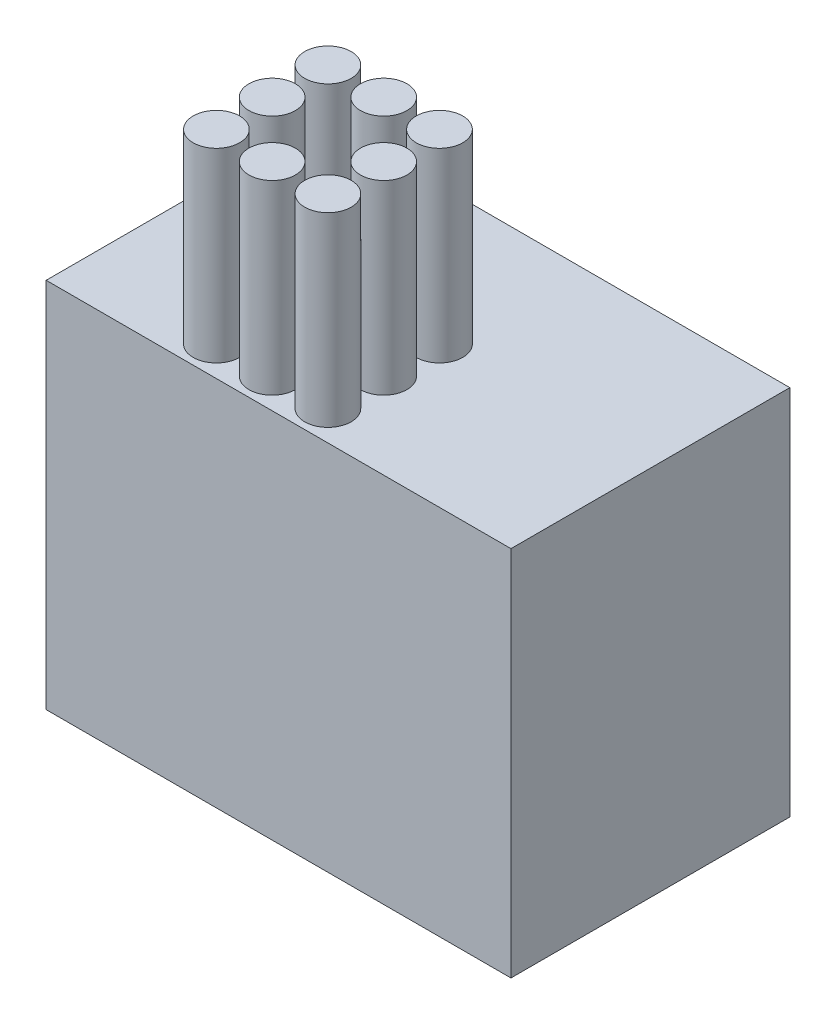
ISO-10303-21;
HEADER;
FILE_DESCRIPTION(('STEP AP214'),'2;1');
FILE_NAME('part.step','',(''),(''),'','','');
FILE_SCHEMA(('AUTOMOTIVE_DESIGN { 1 0 10303 214 1 1 1 1 }'));
ENDSEC;
DATA;
#1=APPLICATION_CONTEXT('core data for automotive mechanical design processes');
#2=APPLICATION_PROTOCOL_DEFINITION('international standard','automotive_design',2000,#1);
#3=PRODUCT_CONTEXT('',#1,'mechanical');
#4=PRODUCT('Part','Part','',(#3));
#5=PRODUCT_RELATED_PRODUCT_CATEGORY('part','',(#4));
#6=PRODUCT_DEFINITION_FORMATION('','',#4);
#7=PRODUCT_DEFINITION_CONTEXT('part definition',#1,'design');
#8=PRODUCT_DEFINITION('design','',#6,#7);
#9=PRODUCT_DEFINITION_SHAPE('','',#8);
#10=(LENGTH_UNIT() NAMED_UNIT(*) SI_UNIT(.MILLI.,.METRE.));
#11=(NAMED_UNIT(*) PLANE_ANGLE_UNIT() SI_UNIT($,.RADIAN.));
#12=(NAMED_UNIT(*) SI_UNIT($,.STERADIAN.) SOLID_ANGLE_UNIT());
#13=UNCERTAINTY_MEASURE_WITH_UNIT(LENGTH_MEASURE(1.E-05),#10,'distance_accuracy_value','');
#14=(GEOMETRIC_REPRESENTATION_CONTEXT(3) GLOBAL_UNCERTAINTY_ASSIGNED_CONTEXT((#13)) GLOBAL_UNIT_ASSIGNED_CONTEXT((#10,
#11,#12)) REPRESENTATION_CONTEXT('',''));
#15=CARTESIAN_POINT('',(0.,0.,0.));
#16=DIRECTION('',(0.,0.,1.));
#17=DIRECTION('',(1.,0.,0.));
#18=AXIS2_PLACEMENT_3D('',#15,#16,#17);
#19=CARTESIAN_POINT('',(38.3392416738444,50.8,68.0273515144054));
#20=DIRECTION('',(0.,1.,0.));
#21=DIRECTION('',(0.,0.,1.));
#22=AXIS2_PLACEMENT_3D('',#19,#20,#21);
#23=PLANE('',#22);
#24=CARTESIAN_POINT('',(38.3392416738444,50.8,68.0273515144054));
#25=DIRECTION('',(0.,1.,0.));
#26=DIRECTION('',(0.,0.,1.));
#27=AXIS2_PLACEMENT_3D('',#24,#25,#26);
#28=CIRCLE('',#27,6.35);
#29=CARTESIAN_POINT('',(38.3392416738444,50.8,74.3773515144054));
#30=VERTEX_POINT('',#29);
#31=EDGE_CURVE('E11',#30,#30,#28,.T.);
#32=ORIENTED_EDGE('',*,*,#31,.T.);
#33=EDGE_LOOP('',(#32));
#34=FACE_BOUND('',#33,.T.);
#35=ADVANCED_FACE('F44',(#34),#23,.T.);
#36=CARTESIAN_POINT('',(38.3392416738444,50.8,68.0273515144054));
#37=DIRECTION('',(0.,-1.,0.));
#38=DIRECTION('',(0.,0.,-1.));
#39=AXIS2_PLACEMENT_3D('',#36,#37,#38);
#40=CYLINDRICAL_SURFACE('',#39,6.35);
#41=ORIENTED_EDGE('',*,*,#31,.F.);
#42=EDGE_LOOP('',(#41));
#43=FACE_BOUND('',#42,.T.);
#44=CARTESIAN_POINT('',(38.3392416738444,0.,68.0273515144054));
#45=DIRECTION('',(0.,-1.,0.));
#46=DIRECTION('',(0.,0.,-1.));
#47=AXIS2_PLACEMENT_3D('',#44,#45,#46);
#48=CIRCLE('',#47,6.35);
#49=CARTESIAN_POINT('',(38.3392416738444,0.,61.6773515144054));
#50=VERTEX_POINT('',#49);
#51=EDGE_CURVE('E53',#50,#50,#48,.F.);
#52=ORIENTED_EDGE('',*,*,#51,.T.);
#53=EDGE_LOOP('',(#52));
#54=FACE_BOUND('',#53,.T.);
#55=ADVANCED_FACE('F184',(#43,#54),#40,.T.);
#56=CARTESIAN_POINT('',(53.5792416738444,50.8,68.0273515144054));
#57=DIRECTION('',(0.,1.,0.));
#58=DIRECTION('',(0.,0.,1.));
#59=AXIS2_PLACEMENT_3D('',#56,#57,#58);
#60=PLANE('',#59);
#61=CARTESIAN_POINT('',(53.5792416738444,50.8,68.0273515144054));
#62=DIRECTION('',(0.,1.,0.));
#63=DIRECTION('',(0.,0.,1.));
#64=AXIS2_PLACEMENT_3D('',#61,#62,#63);
#65=CIRCLE('',#64,6.35);
#66=CARTESIAN_POINT('',(53.5792416738444,50.8,74.3773515144054));
#67=VERTEX_POINT('',#66);
#68=EDGE_CURVE('E177',#67,#67,#65,.T.);
#69=ORIENTED_EDGE('',*,*,#68,.T.);
#70=EDGE_LOOP('',(#69));
#71=FACE_BOUND('',#70,.T.);
#72=ADVANCED_FACE('F205',(#71),#60,.T.);
#73=CARTESIAN_POINT('',(53.5792416738444,50.8,68.0273515144054));
#74=DIRECTION('',(0.,-1.,0.));
#75=DIRECTION('',(0.,0.,-1.));
#76=AXIS2_PLACEMENT_3D('',#73,#74,#75);
#77=CYLINDRICAL_SURFACE('',#76,6.35);
#78=ORIENTED_EDGE('',*,*,#68,.F.);
#79=EDGE_LOOP('',(#78));
#80=FACE_BOUND('',#79,.T.);
#81=CARTESIAN_POINT('',(53.5792416738444,0.,68.0273515144054));
#82=DIRECTION('',(0.,-1.,0.));
#83=DIRECTION('',(0.,0.,-1.));
#84=AXIS2_PLACEMENT_3D('',#81,#82,#83);
#85=CIRCLE('',#84,6.35);
#86=CARTESIAN_POINT('',(53.5792416738444,0.,61.6773515144054));
#87=VERTEX_POINT('',#86);
#88=EDGE_CURVE('E173',#87,#87,#85,.F.);
#89=ORIENTED_EDGE('',*,*,#88,.T.);
#90=EDGE_LOOP('',(#89));
#91=FACE_BOUND('',#90,.T.);
#92=ADVANCED_FACE('F211',(#80,#91),#77,.T.);
#93=CARTESIAN_POINT('',(68.8192416738444,50.8,68.0273515144054));
#94=DIRECTION('',(0.,1.,0.));
#95=DIRECTION('',(0.,0.,1.));
#96=AXIS2_PLACEMENT_3D('',#93,#94,#95);
#97=PLANE('',#96);
#98=CARTESIAN_POINT('',(68.8192416738444,50.8,68.0273515144054));
#99=DIRECTION('',(0.,1.,0.));
#100=DIRECTION('',(0.,0.,1.));
#101=AXIS2_PLACEMENT_3D('',#98,#99,#100);
#102=CIRCLE('',#101,6.35);
#103=CARTESIAN_POINT('',(68.8192416738444,50.8,74.3773515144054));
#104=VERTEX_POINT('',#103);
#105=EDGE_CURVE('E169',#104,#104,#102,.T.);
#106=ORIENTED_EDGE('',*,*,#105,.T.);
#107=EDGE_LOOP('',(#106));
#108=FACE_BOUND('',#107,.T.);
#109=ADVANCED_FACE('F217',(#108),#97,.T.);
#110=CARTESIAN_POINT('',(68.8192416738444,50.8,68.0273515144054));
#111=DIRECTION('',(0.,-1.,0.));
#112=DIRECTION('',(0.,0.,-1.));
#113=AXIS2_PLACEMENT_3D('',#110,#111,#112);
#114=CYLINDRICAL_SURFACE('',#113,6.35);
#115=ORIENTED_EDGE('',*,*,#105,.F.);
#116=EDGE_LOOP('',(#115));
#117=FACE_BOUND('',#116,.T.);
#118=CARTESIAN_POINT('',(68.8192416738444,0.,68.0273515144054));
#119=DIRECTION('',(0.,-1.,0.));
#120=DIRECTION('',(0.,0.,-1.));
#121=AXIS2_PLACEMENT_3D('',#118,#119,#120);
#122=CIRCLE('',#121,6.35);
#123=CARTESIAN_POINT('',(68.8192416738444,0.,61.6773515144054));
#124=VERTEX_POINT('',#123);
#125=EDGE_CURVE('E165',#124,#124,#122,.F.);
#126=ORIENTED_EDGE('',*,*,#125,.T.);
#127=EDGE_LOOP('',(#126));
#128=FACE_BOUND('',#127,.T.);
#129=ADVANCED_FACE('F221',(#117,#128),#114,.T.);
#130=CARTESIAN_POINT('',(38.3392416738444,50.8,52.7873515144054));
#131=DIRECTION('',(0.,1.,0.));
#132=DIRECTION('',(0.,0.,1.));
#133=AXIS2_PLACEMENT_3D('',#130,#131,#132);
#134=PLANE('',#133);
#135=CARTESIAN_POINT('',(38.3392416738444,50.8,52.7873515144054));
#136=DIRECTION('',(0.,1.,0.));
#137=DIRECTION('',(0.,0.,1.));
#138=AXIS2_PLACEMENT_3D('',#135,#136,#137);
#139=CIRCLE('',#138,6.35);
#140=CARTESIAN_POINT('',(38.3392416738444,50.8,59.1373515144054));
#141=VERTEX_POINT('',#140);
#142=EDGE_CURVE('E161',#141,#141,#139,.T.);
#143=ORIENTED_EDGE('',*,*,#142,.T.);
#144=EDGE_LOOP('',(#143));
#145=FACE_BOUND('',#144,.T.);
#146=ADVANCED_FACE('F225',(#145),#134,.T.);
#147=CARTESIAN_POINT('',(38.3392416738444,50.8,52.7873515144054));
#148=DIRECTION('',(0.,-1.,0.));
#149=DIRECTION('',(0.,0.,-1.));
#150=AXIS2_PLACEMENT_3D('',#147,#148,#149);
#151=CYLINDRICAL_SURFACE('',#150,6.35);
#152=ORIENTED_EDGE('',*,*,#142,.F.);
#153=EDGE_LOOP('',(#152));
#154=FACE_BOUND('',#153,.T.);
#155=CARTESIAN_POINT('',(38.3392416738444,0.,52.7873515144054));
#156=DIRECTION('',(0.,-1.,0.));
#157=DIRECTION('',(0.,0.,-1.));
#158=AXIS2_PLACEMENT_3D('',#155,#156,#157);
#159=CIRCLE('',#158,6.35);
#160=CARTESIAN_POINT('',(38.3392416738444,0.,46.4373515144054));
#161=VERTEX_POINT('',#160);
#162=EDGE_CURVE('E157',#161,#161,#159,.F.);
#163=ORIENTED_EDGE('',*,*,#162,.T.);
#164=EDGE_LOOP('',(#163));
#165=FACE_BOUND('',#164,.T.);
#166=ADVANCED_FACE('F229',(#154,#165),#151,.T.);
#167=CARTESIAN_POINT('',(68.8192416738444,50.8,52.7873515144054));
#168=DIRECTION('',(0.,1.,0.));
#169=DIRECTION('',(0.,0.,1.));
#170=AXIS2_PLACEMENT_3D('',#167,#168,#169);
#171=PLANE('',#170);
#172=CARTESIAN_POINT('',(68.8192416738444,50.8,52.7873515144054));
#173=DIRECTION('',(0.,1.,0.));
#174=DIRECTION('',(0.,0.,1.));
#175=AXIS2_PLACEMENT_3D('',#172,#173,#174);
#176=CIRCLE('',#175,6.35);
#177=CARTESIAN_POINT('',(68.8192416738444,50.8,59.1373515144054));
#178=VERTEX_POINT('',#177);
#179=EDGE_CURVE('E153',#178,#178,#176,.T.);
#180=ORIENTED_EDGE('',*,*,#179,.T.);
#181=EDGE_LOOP('',(#180));
#182=FACE_BOUND('',#181,.T.);
#183=ADVANCED_FACE('F233',(#182),#171,.T.);
#184=CARTESIAN_POINT('',(68.8192416738444,50.8,52.7873515144054));
#185=DIRECTION('',(0.,-1.,0.));
#186=DIRECTION('',(0.,0.,-1.));
#187=AXIS2_PLACEMENT_3D('',#184,#185,#186);
#188=CYLINDRICAL_SURFACE('',#187,6.35);
#189=ORIENTED_EDGE('',*,*,#179,.F.);
#190=EDGE_LOOP('',(#189));
#191=FACE_BOUND('',#190,.T.);
#192=CARTESIAN_POINT('',(68.8192416738444,0.,52.7873515144054));
#193=DIRECTION('',(0.,-1.,0.));
#194=DIRECTION('',(0.,0.,-1.));
#195=AXIS2_PLACEMENT_3D('',#192,#193,#194);
#196=CIRCLE('',#195,6.35);
#197=CARTESIAN_POINT('',(68.8192416738444,0.,46.4373515144054));
#198=VERTEX_POINT('',#197);
#199=EDGE_CURVE('E149',#198,#198,#196,.F.);
#200=ORIENTED_EDGE('',*,*,#199,.T.);
#201=EDGE_LOOP('',(#200));
#202=FACE_BOUND('',#201,.T.);
#203=ADVANCED_FACE('F237',(#191,#202),#188,.T.);
#204=CARTESIAN_POINT('',(38.3392416738444,50.8,37.5473515144054));
#205=DIRECTION('',(0.,1.,0.));
#206=DIRECTION('',(0.,0.,1.));
#207=AXIS2_PLACEMENT_3D('',#204,#205,#206);
#208=PLANE('',#207);
#209=CARTESIAN_POINT('',(38.3392416738444,50.8,37.5473515144054));
#210=DIRECTION('',(0.,1.,0.));
#211=DIRECTION('',(0.,0.,1.));
#212=AXIS2_PLACEMENT_3D('',#209,#210,#211);
#213=CIRCLE('',#212,6.35);
#214=CARTESIAN_POINT('',(38.3392416738444,50.8,43.8973515144054));
#215=VERTEX_POINT('',#214);
#216=EDGE_CURVE('E145',#215,#215,#213,.T.);
#217=ORIENTED_EDGE('',*,*,#216,.T.);
#218=EDGE_LOOP('',(#217));
#219=FACE_BOUND('',#218,.T.);
#220=ADVANCED_FACE('F241',(#219),#208,.T.);
#221=CARTESIAN_POINT('',(38.3392416738444,50.8,37.5473515144054));
#222=DIRECTION('',(0.,-1.,0.));
#223=DIRECTION('',(0.,0.,-1.));
#224=AXIS2_PLACEMENT_3D('',#221,#222,#223);
#225=CYLINDRICAL_SURFACE('',#224,6.35);
#226=ORIENTED_EDGE('',*,*,#216,.F.);
#227=EDGE_LOOP('',(#226));
#228=FACE_BOUND('',#227,.T.);
#229=CARTESIAN_POINT('',(38.3392416738444,0.,37.5473515144054));
#230=DIRECTION('',(0.,-1.,0.));
#231=DIRECTION('',(0.,0.,-1.));
#232=AXIS2_PLACEMENT_3D('',#229,#230,#231);
#233=CIRCLE('',#232,6.35);
#234=CARTESIAN_POINT('',(38.3392416738444,0.,31.1973515144054));
#235=VERTEX_POINT('',#234);
#236=EDGE_CURVE('E141',#235,#235,#233,.F.);
#237=ORIENTED_EDGE('',*,*,#236,.T.);
#238=EDGE_LOOP('',(#237));
#239=FACE_BOUND('',#238,.T.);
#240=ADVANCED_FACE('F245',(#228,#239),#225,.T.);
#241=CARTESIAN_POINT('',(0.,0.,76.2));
#242=DIRECTION('',(1.,0.,0.));
#243=DIRECTION('',(0.,1.,0.));
#244=AXIS2_PLACEMENT_3D('',#241,#242,#243);
#245=PLANE('',#244);
#246=DIRECTION('',(0.,-1.,0.));
#247=VECTOR('',#246,1.);
#248=CARTESIAN_POINT('',(0.,0.,0.));
#249=LINE('',#248,#247);
#250=CARTESIAN_POINT('',(0.,0.,0.));
#251=VERTEX_POINT('',#250);
#252=CARTESIAN_POINT('',(0.,-101.6,0.));
#253=VERTEX_POINT('',#252);
#254=EDGE_CURVE('E116',#251,#253,#249,.T.);
#255=ORIENTED_EDGE('',*,*,#254,.T.);
#256=DIRECTION('',(0.,0.,-1.));
#257=VECTOR('',#256,1.);
#258=CARTESIAN_POINT('',(0.,-101.6,76.2));
#259=LINE('',#258,#257);
#260=CARTESIAN_POINT('',(0.,-101.6,76.2));
#261=VERTEX_POINT('',#260);
#262=EDGE_CURVE('E105',#261,#253,#259,.T.);
#263=ORIENTED_EDGE('',*,*,#262,.F.);
#264=DIRECTION('',(0.,-1.,0.));
#265=VECTOR('',#264,1.);
#266=CARTESIAN_POINT('',(0.,0.,76.2));
#267=LINE('',#266,#265);
#268=CARTESIAN_POINT('',(0.,0.,76.2));
#269=VERTEX_POINT('',#268);
#270=EDGE_CURVE('E97',#269,#261,#267,.T.);
#271=ORIENTED_EDGE('',*,*,#270,.F.);
#272=DIRECTION('',(0.,0.,-1.));
#273=VECTOR('',#272,1.);
#274=CARTESIAN_POINT('',(0.,0.,76.2));
#275=LINE('',#274,#273);
#276=EDGE_CURVE('E112',#269,#251,#275,.T.);
#277=ORIENTED_EDGE('',*,*,#276,.T.);
#278=EDGE_LOOP('',(#255,#263,#271,#277));
#279=FACE_BOUND('',#278,.T.);
#280=ADVANCED_FACE('F249',(#279),#245,.F.);
#281=CARTESIAN_POINT('',(0.,-101.6,76.2));
#282=DIRECTION('',(0.,1.,0.));
#283=DIRECTION('',(0.,0.,1.));
#284=AXIS2_PLACEMENT_3D('',#281,#282,#283);
#285=PLANE('',#284);
#286=DIRECTION('',(1.,0.,0.));
#287=VECTOR('',#286,1.);
#288=CARTESIAN_POINT('',(0.,-101.6,0.));
#289=LINE('',#288,#287);
#290=CARTESIAN_POINT('',(127.,-101.6,0.));
#291=VERTEX_POINT('',#290);
#292=EDGE_CURVE('E103',#253,#291,#289,.T.);
#293=ORIENTED_EDGE('',*,*,#292,.T.);
#294=DIRECTION('',(0.,0.,-1.));
#295=VECTOR('',#294,1.);
#296=CARTESIAN_POINT('',(127.,-101.6,76.2));
#297=LINE('',#296,#295);
#298=CARTESIAN_POINT('',(127.,-101.6,76.2));
#299=VERTEX_POINT('',#298);
#300=EDGE_CURVE('E101',#299,#291,#297,.T.);
#301=ORIENTED_EDGE('',*,*,#300,.F.);
#302=DIRECTION('',(1.,0.,0.));
#303=VECTOR('',#302,1.);
#304=CARTESIAN_POINT('',(0.,-101.6,76.2));
#305=LINE('',#304,#303);
#306=EDGE_CURVE('E92',#261,#299,#305,.T.);
#307=ORIENTED_EDGE('',*,*,#306,.F.);
#308=ORIENTED_EDGE('',*,*,#262,.T.);
#309=EDGE_LOOP('',(#293,#301,#307,#308));
#310=FACE_BOUND('',#309,.T.);
#311=ADVANCED_FACE('F102',(#310),#285,.F.);
#312=CARTESIAN_POINT('',(127.,0.,76.2));
#313=DIRECTION('',(-1.,0.,0.));
#314=DIRECTION('',(0.,0.,1.));
#315=AXIS2_PLACEMENT_3D('',#312,#313,#314);
#316=PLANE('',#315);
#317=DIRECTION('',(0.,1.,0.));
#318=VECTOR('',#317,1.);
#319=CARTESIAN_POINT('',(127.,0.,0.));
#320=LINE('',#319,#318);
#321=CARTESIAN_POINT('',(127.,0.,0.));
#322=VERTEX_POINT('',#321);
#323=EDGE_CURVE('E78',#291,#322,#320,.T.);
#324=ORIENTED_EDGE('',*,*,#323,.T.);
#325=DIRECTION('',(0.,0.,-1.));
#326=VECTOR('',#325,1.);
#327=CARTESIAN_POINT('',(127.,0.,76.2));
#328=LINE('',#327,#326);
#329=CARTESIAN_POINT('',(127.,0.,76.2));
#330=VERTEX_POINT('',#329);
#331=EDGE_CURVE('E106',#330,#322,#328,.T.);
#332=ORIENTED_EDGE('',*,*,#331,.F.);
#333=DIRECTION('',(0.,1.,0.));
#334=VECTOR('',#333,1.);
#335=CARTESIAN_POINT('',(127.,0.,76.2));
#336=LINE('',#335,#334);
#337=EDGE_CURVE('E95',#299,#330,#336,.T.);
#338=ORIENTED_EDGE('',*,*,#337,.F.);
#339=ORIENTED_EDGE('',*,*,#300,.T.);
#340=EDGE_LOOP('',(#324,#332,#338,#339));
#341=FACE_BOUND('',#340,.T.);
#342=ADVANCED_FACE('F108',(#341),#316,.F.);
#343=CARTESIAN_POINT('',(0.,0.,76.2));
#344=DIRECTION('',(0.,-1.,0.));
#345=DIRECTION('',(0.,0.,-1.));
#346=AXIS2_PLACEMENT_3D('',#343,#344,#345);
#347=PLANE('',#346);
#348=CARTESIAN_POINT('',(53.5792416738444,0.,37.5473515144054));
#349=DIRECTION('',(0.,-1.,0.));
#350=DIRECTION('',(0.,0.,-1.));
#351=AXIS2_PLACEMENT_3D('',#348,#349,#350);
#352=CIRCLE('',#351,6.35);
#353=CARTESIAN_POINT('',(53.5792416738444,0.,31.1973515144054));
#354=VERTEX_POINT('',#353);
#355=EDGE_CURVE('E137',#354,#354,#352,.F.);
#356=ORIENTED_EDGE('',*,*,#355,.F.);
#357=EDGE_LOOP('',(#356));
#358=FACE_BOUND('',#357,.T.);
#359=CARTESIAN_POINT('',(68.8192416738444,0.,37.5473515144054));
#360=DIRECTION('',(0.,-1.,0.));
#361=DIRECTION('',(0.,0.,-1.));
#362=AXIS2_PLACEMENT_3D('',#359,#360,#361);
#363=CIRCLE('',#362,6.35);
#364=CARTESIAN_POINT('',(68.8192416738444,0.,31.1973515144054));
#365=VERTEX_POINT('',#364);
#366=EDGE_CURVE('E133',#365,#365,#363,.F.);
#367=ORIENTED_EDGE('',*,*,#366,.F.);
#368=EDGE_LOOP('',(#367));
#369=FACE_BOUND('',#368,.T.);
#370=DIRECTION('',(-1.,0.,0.));
#371=VECTOR('',#370,1.);
#372=CARTESIAN_POINT('',(0.,0.,0.));
#373=LINE('',#372,#371);
#374=EDGE_CURVE('E84',#322,#251,#373,.T.);
#375=ORIENTED_EDGE('',*,*,#374,.T.);
#376=ORIENTED_EDGE('',*,*,#276,.F.);
#377=DIRECTION('',(-1.,0.,0.));
#378=VECTOR('',#377,1.);
#379=CARTESIAN_POINT('',(0.,0.,76.2));
#380=LINE('',#379,#378);
#381=EDGE_CURVE('E61',#330,#269,#380,.T.);
#382=ORIENTED_EDGE('',*,*,#381,.F.);
#383=ORIENTED_EDGE('',*,*,#331,.T.);
#384=EDGE_LOOP('',(#375,#376,#382,#383));
#385=FACE_BOUND('',#384,.T.);
#386=ORIENTED_EDGE('',*,*,#236,.F.);
#387=EDGE_LOOP('',(#386));
#388=FACE_BOUND('',#387,.T.);
#389=ORIENTED_EDGE('',*,*,#199,.F.);
#390=EDGE_LOOP('',(#389));
#391=FACE_BOUND('',#390,.T.);
#392=ORIENTED_EDGE('',*,*,#162,.F.);
#393=EDGE_LOOP('',(#392));
#394=FACE_BOUND('',#393,.T.);
#395=ORIENTED_EDGE('',*,*,#125,.F.);
#396=EDGE_LOOP('',(#395));
#397=FACE_BOUND('',#396,.T.);
#398=ORIENTED_EDGE('',*,*,#88,.F.);
#399=EDGE_LOOP('',(#398));
#400=FACE_BOUND('',#399,.T.);
#401=ORIENTED_EDGE('',*,*,#51,.F.);
#402=EDGE_LOOP('',(#401));
#403=FACE_BOUND('',#402,.T.);
#404=ADVANCED_FACE('F186',(#358,#369,#385,#388,#391,#394,#397,#400,#403),#347,.F.);
#405=CARTESIAN_POINT('',(0.,0.,76.2));
#406=DIRECTION('',(0.,0.,1.));
#407=DIRECTION('',(1.,0.,0.));
#408=AXIS2_PLACEMENT_3D('',#405,#406,#407);
#409=PLANE('',#408);
#410=ORIENTED_EDGE('',*,*,#270,.T.);
#411=ORIENTED_EDGE('',*,*,#306,.T.);
#412=ORIENTED_EDGE('',*,*,#337,.T.);
#413=ORIENTED_EDGE('',*,*,#381,.T.);
#414=EDGE_LOOP('',(#410,#411,#412,#413));
#415=FACE_BOUND('',#414,.T.);
#416=ADVANCED_FACE('F93',(#415),#409,.T.);
#417=CARTESIAN_POINT('',(0.,0.,0.));
#418=DIRECTION('',(0.,0.,1.));
#419=DIRECTION('',(1.,0.,0.));
#420=AXIS2_PLACEMENT_3D('',#417,#418,#419);
#421=PLANE('',#420);
#422=ORIENTED_EDGE('',*,*,#254,.F.);
#423=ORIENTED_EDGE('',*,*,#374,.F.);
#424=ORIENTED_EDGE('',*,*,#323,.F.);
#425=ORIENTED_EDGE('',*,*,#292,.F.);
#426=EDGE_LOOP('',(#422,#423,#424,#425));
#427=FACE_BOUND('',#426,.T.);
#428=ADVANCED_FACE('F194',(#427),#421,.F.);
#429=CARTESIAN_POINT('',(68.8192416738444,50.8,37.5473515144054));
#430=DIRECTION('',(0.,-1.,0.));
#431=DIRECTION('',(0.,0.,-1.));
#432=AXIS2_PLACEMENT_3D('',#429,#430,#431);
#433=CYLINDRICAL_SURFACE('',#432,6.35);
#434=CARTESIAN_POINT('',(68.8192416738444,50.8,37.5473515144054));
#435=DIRECTION('',(0.,1.,0.));
#436=DIRECTION('',(0.,0.,1.));
#437=AXIS2_PLACEMENT_3D('',#434,#435,#436);
#438=CIRCLE('',#437,6.35);
#439=CARTESIAN_POINT('',(68.8192416738444,50.8,43.8973515144054));
#440=VERTEX_POINT('',#439);
#441=EDGE_CURVE('E120',#440,#440,#438,.T.);
#442=ORIENTED_EDGE('',*,*,#441,.F.);
#443=EDGE_LOOP('',(#442));
#444=FACE_BOUND('',#443,.T.);
#445=ORIENTED_EDGE('',*,*,#366,.T.);
#446=EDGE_LOOP('',(#445));
#447=FACE_BOUND('',#446,.T.);
#448=ADVANCED_FACE('F284',(#444,#447),#433,.T.);
#449=CARTESIAN_POINT('',(68.8192416738444,50.8,37.5473515144054));
#450=DIRECTION('',(0.,1.,0.));
#451=DIRECTION('',(0.,0.,1.));
#452=AXIS2_PLACEMENT_3D('',#449,#450,#451);
#453=PLANE('',#452);
#454=ORIENTED_EDGE('',*,*,#441,.T.);
#455=EDGE_LOOP('',(#454));
#456=FACE_BOUND('',#455,.T.);
#457=ADVANCED_FACE('F293',(#456),#453,.T.);
#458=CARTESIAN_POINT('',(53.5792416738444,50.8,37.5473515144054));
#459=DIRECTION('',(0.,-1.,0.));
#460=DIRECTION('',(0.,0.,-1.));
#461=AXIS2_PLACEMENT_3D('',#458,#459,#460);
#462=CYLINDRICAL_SURFACE('',#461,6.35);
#463=CARTESIAN_POINT('',(53.5792416738444,50.8,37.5473515144054));
#464=DIRECTION('',(0.,1.,0.));
#465=DIRECTION('',(0.,0.,1.));
#466=AXIS2_PLACEMENT_3D('',#463,#464,#465);
#467=CIRCLE('',#466,6.35);
#468=CARTESIAN_POINT('',(53.5792416738444,50.8,43.8973515144054));
#469=VERTEX_POINT('',#468);
#470=EDGE_CURVE('E489',#469,#469,#467,.T.);
#471=ORIENTED_EDGE('',*,*,#470,.F.);
#472=EDGE_LOOP('',(#471));
#473=FACE_BOUND('',#472,.T.);
#474=ORIENTED_EDGE('',*,*,#355,.T.);
#475=EDGE_LOOP('',(#474));
#476=FACE_BOUND('',#475,.T.);
#477=ADVANCED_FACE('F303',(#473,#476),#462,.T.);
#478=CARTESIAN_POINT('',(53.5792416738444,50.8,37.5473515144054));
#479=DIRECTION('',(0.,1.,0.));
#480=DIRECTION('',(0.,0.,1.));
#481=AXIS2_PLACEMENT_3D('',#478,#479,#480);
#482=PLANE('',#481);
#483=ORIENTED_EDGE('',*,*,#470,.T.);
#484=EDGE_LOOP('',(#483));
#485=FACE_BOUND('',#484,.T.);
#486=ADVANCED_FACE('F313',(#485),#482,.T.);
#487=CLOSED_SHELL('',(#35,#55,#72,#92,#109,#129,#146,#166,#183,#203,#220,#240,#280,#311,#342,
#404,#416,#428,#448,#457,#477,#486));
#488=MANIFOLD_SOLID_BREP('B2',#487);
#489=ADVANCED_BREP_SHAPE_REPRESENTATION('',(#18,#488),#14);
#490=SHAPE_DEFINITION_REPRESENTATION(#9,#489);
ENDSEC;
END-ISO-10303-21;
